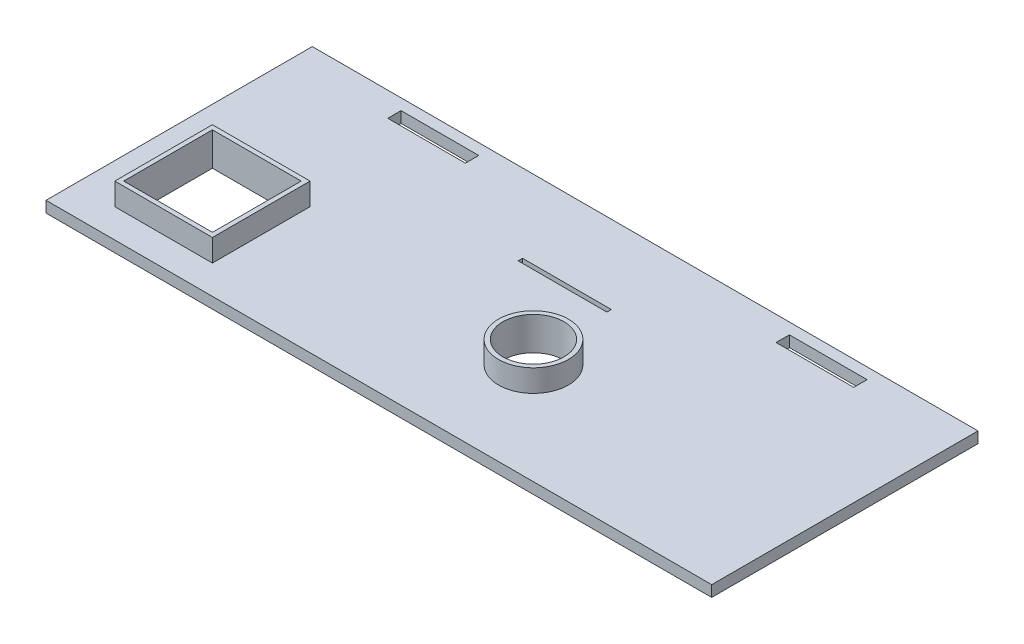
ISO-10303-21;
HEADER;
FILE_DESCRIPTION(('STEP AP214'),'2;1');
FILE_NAME('part.step','',(''),(''),'','','');
FILE_SCHEMA(('AUTOMOTIVE_DESIGN { 1 0 10303 214 1 1 1 1 }'));
ENDSEC;
DATA;
#1=APPLICATION_CONTEXT('core data for automotive mechanical design processes');
#2=APPLICATION_PROTOCOL_DEFINITION('international standard','automotive_design',2000,#1);
#3=PRODUCT_CONTEXT('',#1,'mechanical');
#4=PRODUCT('Part','Part','',(#3));
#5=PRODUCT_RELATED_PRODUCT_CATEGORY('part','',(#4));
#6=PRODUCT_DEFINITION_FORMATION('','',#4);
#7=PRODUCT_DEFINITION_CONTEXT('part definition',#1,'design');
#8=PRODUCT_DEFINITION('design','',#6,#7);
#9=PRODUCT_DEFINITION_SHAPE('','',#8);
#10=(LENGTH_UNIT() NAMED_UNIT(*) SI_UNIT(.MILLI.,.METRE.));
#11=(NAMED_UNIT(*) PLANE_ANGLE_UNIT() SI_UNIT($,.RADIAN.));
#12=(NAMED_UNIT(*) SI_UNIT($,.STERADIAN.) SOLID_ANGLE_UNIT());
#13=UNCERTAINTY_MEASURE_WITH_UNIT(LENGTH_MEASURE(1.E-05),#10,'distance_accuracy_value','');
#14=(GEOMETRIC_REPRESENTATION_CONTEXT(3) GLOBAL_UNCERTAINTY_ASSIGNED_CONTEXT((#13)) GLOBAL_UNIT_ASSIGNED_CONTEXT((#10,
#11,#12)) REPRESENTATION_CONTEXT('',''));
#15=CARTESIAN_POINT('',(0.,0.,0.));
#16=DIRECTION('',(0.,0.,1.));
#17=DIRECTION('',(1.,0.,0.));
#18=AXIS2_PLACEMENT_3D('',#15,#16,#17);
#19=CARTESIAN_POINT('',(0.,5.,0.));
#20=DIRECTION('',(0.,-1.,0.));
#21=DIRECTION('',(0.,0.,-1.));
#22=AXIS2_PLACEMENT_3D('',#19,#20,#21);
#23=PLANE('',#22);
#24=DIRECTION('',(0.,0.,-1.));
#25=VECTOR('',#24,1.);
#26=CARTESIAN_POINT('',(-88.,5.,47.));
#27=LINE('',#26,#25);
#28=CARTESIAN_POINT('',(-88.,5.,47.));
#29=VERTEX_POINT('',#28);
#30=CARTESIAN_POINT('',(-88.,5.,2.99999999999998));
#31=VERTEX_POINT('',#30);
#32=EDGE_CURVE('E254',#29,#31,#27,.T.);
#33=ORIENTED_EDGE('',*,*,#32,.F.);
#34=DIRECTION('',(1.,0.,0.));
#35=VECTOR('',#34,1.);
#36=CARTESIAN_POINT('',(-132.,5.,47.));
#37=LINE('',#36,#35);
#38=CARTESIAN_POINT('',(-132.,5.,47.));
#39=VERTEX_POINT('',#38);
#40=EDGE_CURVE('E259',#39,#29,#37,.T.);
#41=ORIENTED_EDGE('',*,*,#40,.F.);
#42=DIRECTION('',(0.,0.,1.));
#43=VECTOR('',#42,1.);
#44=CARTESIAN_POINT('',(-132.,5.,2.99999999999999));
#45=LINE('',#44,#43);
#46=CARTESIAN_POINT('',(-132.,5.,2.99999999999999));
#47=VERTEX_POINT('',#46);
#48=EDGE_CURVE('E83',#47,#39,#45,.T.);
#49=ORIENTED_EDGE('',*,*,#48,.F.);
#50=DIRECTION('',(-1.,0.,0.));
#51=VECTOR('',#50,1.);
#52=CARTESIAN_POINT('',(-88.,5.,2.99999999999998));
#53=LINE('',#52,#51);
#54=EDGE_CURVE('E78',#31,#47,#53,.T.);
#55=ORIENTED_EDGE('',*,*,#54,.F.);
#56=EDGE_LOOP('',(#33,#41,#49,#55));
#57=FACE_BOUND('',#56,.T.);
#58=DIRECTION('',(0.,0.,1.));
#59=VECTOR('',#58,1.);
#60=CARTESIAN_POINT('',(-105.,5.,-55.));
#61=LINE('',#60,#59);
#62=CARTESIAN_POINT('',(-105.,5.,-55.));
#63=VERTEX_POINT('',#62);
#64=CARTESIAN_POINT('',(-105.,5.,-49.));
#65=VERTEX_POINT('',#64);
#66=EDGE_CURVE('E360',#63,#65,#61,.T.);
#67=ORIENTED_EDGE('',*,*,#66,.F.);
#68=DIRECTION('',(-1.,0.,0.));
#69=VECTOR('',#68,1.);
#70=CARTESIAN_POINT('',(-70.,5.,-55.));
#71=LINE('',#70,#69);
#72=CARTESIAN_POINT('',(-70.,5.,-55.));
#73=VERTEX_POINT('',#72);
#74=EDGE_CURVE('E368',#73,#63,#71,.T.);
#75=ORIENTED_EDGE('',*,*,#74,.F.);
#76=DIRECTION('',(0.,0.,-1.));
#77=VECTOR('',#76,1.);
#78=CARTESIAN_POINT('',(-70.,5.,-55.));
#79=LINE('',#78,#77);
#80=CARTESIAN_POINT('',(-70.,5.,-49.));
#81=VERTEX_POINT('',#80);
#82=EDGE_CURVE('E365',#81,#73,#79,.T.);
#83=ORIENTED_EDGE('',*,*,#82,.F.);
#84=DIRECTION('',(1.,0.,0.));
#85=VECTOR('',#84,1.);
#86=CARTESIAN_POINT('',(-70.,5.,-49.));
#87=LINE('',#86,#85);
#88=EDGE_CURVE('E362',#65,#81,#87,.T.);
#89=ORIENTED_EDGE('',*,*,#88,.F.);
#90=EDGE_LOOP('',(#67,#75,#83,#89));
#91=FACE_BOUND('',#90,.T.);
#92=DIRECTION('',(0.,0.,1.));
#93=VECTOR('',#92,1.);
#94=CARTESIAN_POINT('',(-150.,5.,-60.));
#95=LINE('',#94,#93);
#96=CARTESIAN_POINT('',(-150.,5.,-60.));
#97=VERTEX_POINT('',#96);
#98=CARTESIAN_POINT('',(-150.,5.,60.));
#99=VERTEX_POINT('',#98);
#100=EDGE_CURVE('E391',#97,#99,#95,.T.);
#101=ORIENTED_EDGE('',*,*,#100,.T.);
#102=DIRECTION('',(1.,0.,0.));
#103=VECTOR('',#102,1.);
#104=CARTESIAN_POINT('',(150.,5.,60.));
#105=LINE('',#104,#103);
#106=CARTESIAN_POINT('',(150.,5.,60.));
#107=VERTEX_POINT('',#106);
#108=EDGE_CURVE('E394',#99,#107,#105,.T.);
#109=ORIENTED_EDGE('',*,*,#108,.T.);
#110=DIRECTION('',(0.,0.,-1.));
#111=VECTOR('',#110,1.);
#112=CARTESIAN_POINT('',(150.,5.,-60.));
#113=LINE('',#112,#111);
#114=CARTESIAN_POINT('',(150.,5.,-60.));
#115=VERTEX_POINT('',#114);
#116=EDGE_CURVE('E397',#107,#115,#113,.T.);
#117=ORIENTED_EDGE('',*,*,#116,.T.);
#118=DIRECTION('',(-1.,0.,0.));
#119=VECTOR('',#118,1.);
#120=CARTESIAN_POINT('',(150.,5.,-60.));
#121=LINE('',#120,#119);
#122=EDGE_CURVE('E399',#115,#97,#121,.T.);
#123=ORIENTED_EDGE('',*,*,#122,.T.);
#124=EDGE_LOOP('',(#101,#109,#117,#123));
#125=FACE_BOUND('',#124,.T.);
#126=DIRECTION('',(0.,0.,1.));
#127=VECTOR('',#126,1.);
#128=CARTESIAN_POINT('',(70.,5.,-55.));
#129=LINE('',#128,#127);
#130=CARTESIAN_POINT('',(70.,5.,-55.));
#131=VERTEX_POINT('',#130);
#132=CARTESIAN_POINT('',(70.,5.,-49.));
#133=VERTEX_POINT('',#132);
#134=EDGE_CURVE('E329',#131,#133,#129,.T.);
#135=ORIENTED_EDGE('',*,*,#134,.F.);
#136=DIRECTION('',(-1.,0.,0.));
#137=VECTOR('',#136,1.);
#138=CARTESIAN_POINT('',(105.,5.,-55.));
#139=LINE('',#138,#137);
#140=CARTESIAN_POINT('',(105.,5.,-55.));
#141=VERTEX_POINT('',#140);
#142=EDGE_CURVE('E337',#141,#131,#139,.T.);
#143=ORIENTED_EDGE('',*,*,#142,.F.);
#144=DIRECTION('',(0.,0.,-1.));
#145=VECTOR('',#144,1.);
#146=CARTESIAN_POINT('',(105.,5.,-55.));
#147=LINE('',#146,#145);
#148=CARTESIAN_POINT('',(105.,5.,-49.));
#149=VERTEX_POINT('',#148);
#150=EDGE_CURVE('E334',#149,#141,#147,.T.);
#151=ORIENTED_EDGE('',*,*,#150,.F.);
#152=DIRECTION('',(1.,0.,0.));
#153=VECTOR('',#152,1.);
#154=CARTESIAN_POINT('',(105.,5.,-49.));
#155=LINE('',#154,#153);
#156=EDGE_CURVE('E331',#133,#149,#155,.T.);
#157=ORIENTED_EDGE('',*,*,#156,.F.);
#158=EDGE_LOOP('',(#135,#143,#151,#157));
#159=FACE_BOUND('',#158,.T.);
#160=DIRECTION('',(0.,0.,1.));
#161=VECTOR('',#160,1.);
#162=CARTESIAN_POINT('',(-20.,5.,-22.7567864531014));
#163=LINE('',#162,#161);
#164=CARTESIAN_POINT('',(-20.,5.,-24.7567864531014));
#165=VERTEX_POINT('',#164);
#166=CARTESIAN_POINT('',(-20.,5.,-22.7567864531014));
#167=VERTEX_POINT('',#166);
#168=EDGE_CURVE('E286',#165,#167,#163,.T.);
#169=ORIENTED_EDGE('',*,*,#168,.F.);
#170=DIRECTION('',(-1.,0.,0.));
#171=VECTOR('',#170,1.);
#172=CARTESIAN_POINT('',(20.,5.,-24.7567864531014));
#173=LINE('',#172,#171);
#174=CARTESIAN_POINT('',(20.,5.,-24.7567864531014));
#175=VERTEX_POINT('',#174);
#176=EDGE_CURVE('E294',#175,#165,#173,.T.);
#177=ORIENTED_EDGE('',*,*,#176,.F.);
#178=DIRECTION('',(0.,0.,-1.));
#179=VECTOR('',#178,1.);
#180=CARTESIAN_POINT('',(20.,5.,-22.7567864531014));
#181=LINE('',#180,#179);
#182=CARTESIAN_POINT('',(20.,5.,-22.7567864531014));
#183=VERTEX_POINT('',#182);
#184=EDGE_CURVE('E291',#183,#175,#181,.T.);
#185=ORIENTED_EDGE('',*,*,#184,.F.);
#186=DIRECTION('',(1.,0.,0.));
#187=VECTOR('',#186,1.);
#188=CARTESIAN_POINT('',(20.,5.,-22.7567864531014));
#189=LINE('',#188,#187);
#190=EDGE_CURVE('E288',#167,#183,#189,.T.);
#191=ORIENTED_EDGE('',*,*,#190,.F.);
#192=EDGE_LOOP('',(#169,#177,#185,#191));
#193=FACE_BOUND('',#192,.T.);
#194=CARTESIAN_POINT('',(24.0743870529523,5.,14.4073090658306));
#195=DIRECTION('',(0.,-1.,0.));
#196=DIRECTION('',(0.,0.,-1.));
#197=AXIS2_PLACEMENT_3D('',#194,#195,#196);
#198=CIRCLE('',#197,15.75);
#199=CARTESIAN_POINT('',(24.0743870529523,5.,-1.3426909341694));
#200=VERTEX_POINT('',#199);
#201=EDGE_CURVE('E12',#200,#200,#198,.F.);
#202=ORIENTED_EDGE('',*,*,#201,.F.);
#203=EDGE_LOOP('',(#202));
#204=FACE_BOUND('',#203,.T.);
#205=ADVANCED_FACE('F63',(#57,#91,#125,#159,#193,#204),#23,.F.);
#206=CARTESIAN_POINT('',(0.,0.,0.));
#207=DIRECTION('',(0.,-1.,0.));
#208=DIRECTION('',(0.,0.,-1.));
#209=AXIS2_PLACEMENT_3D('',#206,#207,#208);
#210=PLANE('',#209);
#211=DIRECTION('',(-1.,0.,0.));
#212=VECTOR('',#211,1.);
#213=CARTESIAN_POINT('',(20.,0.,-24.7567864531014));
#214=LINE('',#213,#212);
#215=CARTESIAN_POINT('',(20.,0.,-24.7567864531014));
#216=VERTEX_POINT('',#215);
#217=CARTESIAN_POINT('',(-20.,0.,-24.7567864531014));
#218=VERTEX_POINT('',#217);
#219=EDGE_CURVE('E289',#216,#218,#214,.T.);
#220=ORIENTED_EDGE('',*,*,#219,.T.);
#221=DIRECTION('',(0.,0.,1.));
#222=VECTOR('',#221,1.);
#223=CARTESIAN_POINT('',(-20.,0.,-22.7567864531014));
#224=LINE('',#223,#222);
#225=CARTESIAN_POINT('',(-20.,0.,-22.7567864531014));
#226=VERTEX_POINT('',#225);
#227=EDGE_CURVE('E285',#218,#226,#224,.T.);
#228=ORIENTED_EDGE('',*,*,#227,.T.);
#229=DIRECTION('',(1.,0.,0.));
#230=VECTOR('',#229,1.);
#231=CARTESIAN_POINT('',(20.,0.,-22.7567864531014));
#232=LINE('',#231,#230);
#233=CARTESIAN_POINT('',(20.,0.,-22.7567864531014));
#234=VERTEX_POINT('',#233);
#235=EDGE_CURVE('E299',#226,#234,#232,.T.);
#236=ORIENTED_EDGE('',*,*,#235,.T.);
#237=DIRECTION('',(0.,0.,-1.));
#238=VECTOR('',#237,1.);
#239=CARTESIAN_POINT('',(20.,0.,-22.7567864531014));
#240=LINE('',#239,#238);
#241=EDGE_CURVE('E302',#234,#216,#240,.T.);
#242=ORIENTED_EDGE('',*,*,#241,.T.);
#243=EDGE_LOOP('',(#220,#228,#236,#242));
#244=FACE_BOUND('',#243,.T.);
#245=DIRECTION('',(-1.,0.,0.));
#246=VECTOR('',#245,1.);
#247=CARTESIAN_POINT('',(-90.,0.,4.99999999999998));
#248=LINE('',#247,#246);
#249=CARTESIAN_POINT('',(-90.,0.,4.99999999999998));
#250=VERTEX_POINT('',#249);
#251=CARTESIAN_POINT('',(-130.,0.,4.99999999999999));
#252=VERTEX_POINT('',#251);
#253=EDGE_CURVE('E322',#250,#252,#248,.T.);
#254=ORIENTED_EDGE('',*,*,#253,.T.);
#255=DIRECTION('',(0.,0.,1.));
#256=VECTOR('',#255,1.);
#257=CARTESIAN_POINT('',(-130.,0.,4.99999999999999));
#258=LINE('',#257,#256);
#259=CARTESIAN_POINT('',(-130.,0.,45.));
#260=VERTEX_POINT('',#259);
#261=EDGE_CURVE('E316',#252,#260,#258,.T.);
#262=ORIENTED_EDGE('',*,*,#261,.T.);
#263=DIRECTION('',(1.,0.,0.));
#264=VECTOR('',#263,1.);
#265=CARTESIAN_POINT('',(-90.,0.,45.));
#266=LINE('',#265,#264);
#267=CARTESIAN_POINT('',(-90.,0.,45.));
#268=VERTEX_POINT('',#267);
#269=EDGE_CURVE('E229',#260,#268,#266,.T.);
#270=ORIENTED_EDGE('',*,*,#269,.T.);
#271=DIRECTION('',(0.,0.,-1.));
#272=VECTOR('',#271,1.);
#273=CARTESIAN_POINT('',(-90.,0.,4.99999999999998));
#274=LINE('',#273,#272);
#275=EDGE_CURVE('E319',#268,#250,#274,.T.);
#276=ORIENTED_EDGE('',*,*,#275,.T.);
#277=EDGE_LOOP('',(#254,#262,#270,#276));
#278=FACE_BOUND('',#277,.T.);
#279=DIRECTION('',(-1.,0.,0.));
#280=VECTOR('',#279,1.);
#281=CARTESIAN_POINT('',(105.,0.,-55.));
#282=LINE('',#281,#280);
#283=CARTESIAN_POINT('',(105.,0.,-55.));
#284=VERTEX_POINT('',#283);
#285=CARTESIAN_POINT('',(70.,0.,-55.));
#286=VERTEX_POINT('',#285);
#287=EDGE_CURVE('E332',#284,#286,#282,.T.);
#288=ORIENTED_EDGE('',*,*,#287,.T.);
#289=DIRECTION('',(0.,0.,1.));
#290=VECTOR('',#289,1.);
#291=CARTESIAN_POINT('',(70.,0.,-55.));
#292=LINE('',#291,#290);
#293=CARTESIAN_POINT('',(70.,0.,-49.));
#294=VERTEX_POINT('',#293);
#295=EDGE_CURVE('E232',#286,#294,#292,.T.);
#296=ORIENTED_EDGE('',*,*,#295,.T.);
#297=DIRECTION('',(1.,0.,0.));
#298=VECTOR('',#297,1.);
#299=CARTESIAN_POINT('',(105.,0.,-49.));
#300=LINE('',#299,#298);
#301=CARTESIAN_POINT('',(105.,0.,-49.));
#302=VERTEX_POINT('',#301);
#303=EDGE_CURVE('E342',#294,#302,#300,.T.);
#304=ORIENTED_EDGE('',*,*,#303,.T.);
#305=DIRECTION('',(0.,0.,-1.));
#306=VECTOR('',#305,1.);
#307=CARTESIAN_POINT('',(105.,0.,-55.));
#308=LINE('',#307,#306);
#309=EDGE_CURVE('E345',#302,#284,#308,.T.);
#310=ORIENTED_EDGE('',*,*,#309,.T.);
#311=EDGE_LOOP('',(#288,#296,#304,#310));
#312=FACE_BOUND('',#311,.T.);
#313=DIRECTION('',(-1.,0.,0.));
#314=VECTOR('',#313,1.);
#315=CARTESIAN_POINT('',(-70.,0.,-55.));
#316=LINE('',#315,#314);
#317=CARTESIAN_POINT('',(-70.,0.,-55.));
#318=VERTEX_POINT('',#317);
#319=CARTESIAN_POINT('',(-105.,0.,-55.));
#320=VERTEX_POINT('',#319);
#321=EDGE_CURVE('E363',#318,#320,#316,.T.);
#322=ORIENTED_EDGE('',*,*,#321,.T.);
#323=DIRECTION('',(0.,0.,1.));
#324=VECTOR('',#323,1.);
#325=CARTESIAN_POINT('',(-105.,0.,-55.));
#326=LINE('',#325,#324);
#327=CARTESIAN_POINT('',(-105.,0.,-49.));
#328=VERTEX_POINT('',#327);
#329=EDGE_CURVE('E359',#320,#328,#326,.T.);
#330=ORIENTED_EDGE('',*,*,#329,.T.);
#331=DIRECTION('',(1.,0.,0.));
#332=VECTOR('',#331,1.);
#333=CARTESIAN_POINT('',(-70.,0.,-49.));
#334=LINE('',#333,#332);
#335=CARTESIAN_POINT('',(-70.,0.,-49.));
#336=VERTEX_POINT('',#335);
#337=EDGE_CURVE('E373',#328,#336,#334,.T.);
#338=ORIENTED_EDGE('',*,*,#337,.T.);
#339=DIRECTION('',(0.,0.,-1.));
#340=VECTOR('',#339,1.);
#341=CARTESIAN_POINT('',(-70.,0.,-55.));
#342=LINE('',#341,#340);
#343=EDGE_CURVE('E376',#336,#318,#342,.T.);
#344=ORIENTED_EDGE('',*,*,#343,.T.);
#345=EDGE_LOOP('',(#322,#330,#338,#344));
#346=FACE_BOUND('',#345,.T.);
#347=DIRECTION('',(0.,0.,1.));
#348=VECTOR('',#347,1.);
#349=CARTESIAN_POINT('',(-150.,0.,-60.));
#350=LINE('',#349,#348);
#351=CARTESIAN_POINT('',(-150.,0.,-60.));
#352=VERTEX_POINT('',#351);
#353=CARTESIAN_POINT('',(-150.,0.,60.));
#354=VERTEX_POINT('',#353);
#355=EDGE_CURVE('E390',#352,#354,#350,.T.);
#356=ORIENTED_EDGE('',*,*,#355,.F.);
#357=DIRECTION('',(-1.,0.,0.));
#358=VECTOR('',#357,1.);
#359=CARTESIAN_POINT('',(150.,0.,-60.));
#360=LINE('',#359,#358);
#361=CARTESIAN_POINT('',(150.,0.,-60.));
#362=VERTEX_POINT('',#361);
#363=EDGE_CURVE('E395',#362,#352,#360,.T.);
#364=ORIENTED_EDGE('',*,*,#363,.F.);
#365=DIRECTION('',(0.,0.,-1.));
#366=VECTOR('',#365,1.);
#367=CARTESIAN_POINT('',(150.,0.,-60.));
#368=LINE('',#367,#366);
#369=CARTESIAN_POINT('',(150.,0.,60.));
#370=VERTEX_POINT('',#369);
#371=EDGE_CURVE('E406',#370,#362,#368,.T.);
#372=ORIENTED_EDGE('',*,*,#371,.F.);
#373=DIRECTION('',(1.,0.,0.));
#374=VECTOR('',#373,1.);
#375=CARTESIAN_POINT('',(150.,0.,60.));
#376=LINE('',#375,#374);
#377=EDGE_CURVE('E404',#354,#370,#376,.T.);
#378=ORIENTED_EDGE('',*,*,#377,.F.);
#379=EDGE_LOOP('',(#356,#364,#372,#378));
#380=FACE_BOUND('',#379,.T.);
#381=CARTESIAN_POINT('',(24.0743870529523,0.,14.4073090658306));
#382=DIRECTION('',(0.,1.,0.));
#383=DIRECTION('',(0.,0.,1.));
#384=AXIS2_PLACEMENT_3D('',#381,#382,#383);
#385=CIRCLE('',#384,13.75);
#386=CARTESIAN_POINT('',(24.0743870529523,0.,28.1573090658306));
#387=VERTEX_POINT('',#386);
#388=EDGE_CURVE('E282',#387,#387,#385,.T.);
#389=ORIENTED_EDGE('',*,*,#388,.T.);
#390=EDGE_LOOP('',(#389));
#391=FACE_BOUND('',#390,.T.);
#392=ADVANCED_FACE('F427',(#244,#278,#312,#346,#380,#391),#210,.T.);
#393=CARTESIAN_POINT('',(-150.,5.,-60.));
#394=DIRECTION('',(1.,0.,0.));
#395=DIRECTION('',(0.,0.,-1.));
#396=AXIS2_PLACEMENT_3D('',#393,#394,#395);
#397=PLANE('',#396);
#398=ORIENTED_EDGE('',*,*,#355,.T.);
#399=DIRECTION('',(0.,-1.,0.));
#400=VECTOR('',#399,1.);
#401=CARTESIAN_POINT('',(-150.,5.,60.));
#402=LINE('',#401,#400);
#403=EDGE_CURVE('E71',#99,#354,#402,.T.);
#404=ORIENTED_EDGE('',*,*,#403,.F.);
#405=ORIENTED_EDGE('',*,*,#100,.F.);
#406=DIRECTION('',(0.,-1.,0.));
#407=VECTOR('',#406,1.);
#408=CARTESIAN_POINT('',(-150.,5.,-60.));
#409=LINE('',#408,#407);
#410=EDGE_CURVE('E401',#97,#352,#409,.T.);
#411=ORIENTED_EDGE('',*,*,#410,.T.);
#412=EDGE_LOOP('',(#398,#404,#405,#411));
#413=FACE_BOUND('',#412,.T.);
#414=ADVANCED_FACE('F65',(#413),#397,.F.);
#415=CARTESIAN_POINT('',(150.,5.,60.));
#416=DIRECTION('',(0.,0.,-1.));
#417=DIRECTION('',(-1.,0.,0.));
#418=AXIS2_PLACEMENT_3D('',#415,#416,#417);
#419=PLANE('',#418);
#420=ORIENTED_EDGE('',*,*,#377,.T.);
#421=DIRECTION('',(0.,-1.,0.));
#422=VECTOR('',#421,1.);
#423=CARTESIAN_POINT('',(150.,5.,60.));
#424=LINE('',#423,#422);
#425=EDGE_CURVE('E414',#107,#370,#424,.T.);
#426=ORIENTED_EDGE('',*,*,#425,.F.);
#427=ORIENTED_EDGE('',*,*,#108,.F.);
#428=ORIENTED_EDGE('',*,*,#403,.T.);
#429=EDGE_LOOP('',(#420,#426,#427,#428));
#430=FACE_BOUND('',#429,.T.);
#431=ADVANCED_FACE('F419',(#430),#419,.F.);
#432=CARTESIAN_POINT('',(150.,5.,-60.));
#433=DIRECTION('',(-1.,0.,0.));
#434=DIRECTION('',(0.,0.,1.));
#435=AXIS2_PLACEMENT_3D('',#432,#433,#434);
#436=PLANE('',#435);
#437=ORIENTED_EDGE('',*,*,#371,.T.);
#438=DIRECTION('',(0.,-1.,0.));
#439=VECTOR('',#438,1.);
#440=CARTESIAN_POINT('',(150.,5.,-60.));
#441=LINE('',#440,#439);
#442=EDGE_CURVE('E411',#115,#362,#441,.T.);
#443=ORIENTED_EDGE('',*,*,#442,.F.);
#444=ORIENTED_EDGE('',*,*,#116,.F.);
#445=ORIENTED_EDGE('',*,*,#425,.T.);
#446=EDGE_LOOP('',(#437,#443,#444,#445));
#447=FACE_BOUND('',#446,.T.);
#448=ADVANCED_FACE('F432',(#447),#436,.F.);
#449=CARTESIAN_POINT('',(150.,5.,-60.));
#450=DIRECTION('',(0.,0.,1.));
#451=DIRECTION('',(1.,0.,0.));
#452=AXIS2_PLACEMENT_3D('',#449,#450,#451);
#453=PLANE('',#452);
#454=ORIENTED_EDGE('',*,*,#363,.T.);
#455=ORIENTED_EDGE('',*,*,#410,.F.);
#456=ORIENTED_EDGE('',*,*,#122,.F.);
#457=ORIENTED_EDGE('',*,*,#442,.T.);
#458=EDGE_LOOP('',(#454,#455,#456,#457));
#459=FACE_BOUND('',#458,.T.);
#460=ADVANCED_FACE('F436',(#459),#453,.F.);
#461=CARTESIAN_POINT('',(-105.,5.,-55.));
#462=DIRECTION('',(1.,0.,0.));
#463=DIRECTION('',(0.,0.,-1.));
#464=AXIS2_PLACEMENT_3D('',#461,#462,#463);
#465=PLANE('',#464);
#466=ORIENTED_EDGE('',*,*,#329,.F.);
#467=DIRECTION('',(0.,-1.,0.));
#468=VECTOR('',#467,1.);
#469=CARTESIAN_POINT('',(-105.,5.,-55.));
#470=LINE('',#469,#468);
#471=EDGE_CURVE('E370',#63,#320,#470,.T.);
#472=ORIENTED_EDGE('',*,*,#471,.F.);
#473=ORIENTED_EDGE('',*,*,#66,.T.);
#474=DIRECTION('',(0.,-1.,0.));
#475=VECTOR('',#474,1.);
#476=CARTESIAN_POINT('',(-105.,5.,-49.));
#477=LINE('',#476,#475);
#478=EDGE_CURVE('E387',#65,#328,#477,.T.);
#479=ORIENTED_EDGE('',*,*,#478,.T.);
#480=EDGE_LOOP('',(#466,#472,#473,#479));
#481=FACE_BOUND('',#480,.T.);
#482=ADVANCED_FACE('F541',(#481),#465,.T.);
#483=CARTESIAN_POINT('',(-70.,5.,-49.));
#484=DIRECTION('',(0.,0.,-1.));
#485=DIRECTION('',(-1.,0.,0.));
#486=AXIS2_PLACEMENT_3D('',#483,#484,#485);
#487=PLANE('',#486);
#488=ORIENTED_EDGE('',*,*,#337,.F.);
#489=ORIENTED_EDGE('',*,*,#478,.F.);
#490=ORIENTED_EDGE('',*,*,#88,.T.);
#491=DIRECTION('',(0.,-1.,0.));
#492=VECTOR('',#491,1.);
#493=CARTESIAN_POINT('',(-70.,5.,-49.));
#494=LINE('',#493,#492);
#495=EDGE_CURVE('E385',#81,#336,#494,.T.);
#496=ORIENTED_EDGE('',*,*,#495,.T.);
#497=EDGE_LOOP('',(#488,#489,#490,#496));
#498=FACE_BOUND('',#497,.T.);
#499=ADVANCED_FACE('F537',(#498),#487,.T.);
#500=CARTESIAN_POINT('',(-70.,5.,-55.));
#501=DIRECTION('',(-1.,0.,0.));
#502=DIRECTION('',(0.,0.,1.));
#503=AXIS2_PLACEMENT_3D('',#500,#501,#502);
#504=PLANE('',#503);
#505=ORIENTED_EDGE('',*,*,#343,.F.);
#506=ORIENTED_EDGE('',*,*,#495,.F.);
#507=ORIENTED_EDGE('',*,*,#82,.T.);
#508=DIRECTION('',(0.,-1.,0.));
#509=VECTOR('',#508,1.);
#510=CARTESIAN_POINT('',(-70.,5.,-55.));
#511=LINE('',#510,#509);
#512=EDGE_CURVE('E383',#73,#318,#511,.T.);
#513=ORIENTED_EDGE('',*,*,#512,.T.);
#514=EDGE_LOOP('',(#505,#506,#507,#513));
#515=FACE_BOUND('',#514,.T.);
#516=ADVANCED_FACE('F533',(#515),#504,.T.);
#517=CARTESIAN_POINT('',(-70.,5.,-55.));
#518=DIRECTION('',(0.,0.,1.));
#519=DIRECTION('',(1.,0.,0.));
#520=AXIS2_PLACEMENT_3D('',#517,#518,#519);
#521=PLANE('',#520);
#522=ORIENTED_EDGE('',*,*,#321,.F.);
#523=ORIENTED_EDGE('',*,*,#512,.F.);
#524=ORIENTED_EDGE('',*,*,#74,.T.);
#525=ORIENTED_EDGE('',*,*,#471,.T.);
#526=EDGE_LOOP('',(#522,#523,#524,#525));
#527=FACE_BOUND('',#526,.T.);
#528=ADVANCED_FACE('F529',(#527),#521,.T.);
#529=CARTESIAN_POINT('',(70.,5.,-55.));
#530=DIRECTION('',(1.,0.,0.));
#531=DIRECTION('',(0.,0.,-1.));
#532=AXIS2_PLACEMENT_3D('',#529,#530,#531);
#533=PLANE('',#532);
#534=ORIENTED_EDGE('',*,*,#295,.F.);
#535=DIRECTION('',(0.,-1.,0.));
#536=VECTOR('',#535,1.);
#537=CARTESIAN_POINT('',(70.,5.,-55.));
#538=LINE('',#537,#536);
#539=EDGE_CURVE('E339',#131,#286,#538,.T.);
#540=ORIENTED_EDGE('',*,*,#539,.F.);
#541=ORIENTED_EDGE('',*,*,#134,.T.);
#542=DIRECTION('',(0.,-1.,0.));
#543=VECTOR('',#542,1.);
#544=CARTESIAN_POINT('',(70.,5.,-49.));
#545=LINE('',#544,#543);
#546=EDGE_CURVE('E356',#133,#294,#545,.T.);
#547=ORIENTED_EDGE('',*,*,#546,.T.);
#548=EDGE_LOOP('',(#534,#540,#541,#547));
#549=FACE_BOUND('',#548,.T.);
#550=ADVANCED_FACE('F525',(#549),#533,.T.);
#551=CARTESIAN_POINT('',(105.,5.,-49.));
#552=DIRECTION('',(0.,0.,-1.));
#553=DIRECTION('',(-1.,0.,0.));
#554=AXIS2_PLACEMENT_3D('',#551,#552,#553);
#555=PLANE('',#554);
#556=ORIENTED_EDGE('',*,*,#303,.F.);
#557=ORIENTED_EDGE('',*,*,#546,.F.);
#558=ORIENTED_EDGE('',*,*,#156,.T.);
#559=DIRECTION('',(0.,-1.,0.));
#560=VECTOR('',#559,1.);
#561=CARTESIAN_POINT('',(105.,5.,-49.));
#562=LINE('',#561,#560);
#563=EDGE_CURVE('E354',#149,#302,#562,.T.);
#564=ORIENTED_EDGE('',*,*,#563,.T.);
#565=EDGE_LOOP('',(#556,#557,#558,#564));
#566=FACE_BOUND('',#565,.T.);
#567=ADVANCED_FACE('F521',(#566),#555,.T.);
#568=CARTESIAN_POINT('',(105.,5.,-55.));
#569=DIRECTION('',(-1.,0.,0.));
#570=DIRECTION('',(0.,0.,1.));
#571=AXIS2_PLACEMENT_3D('',#568,#569,#570);
#572=PLANE('',#571);
#573=ORIENTED_EDGE('',*,*,#309,.F.);
#574=ORIENTED_EDGE('',*,*,#563,.F.);
#575=ORIENTED_EDGE('',*,*,#150,.T.);
#576=DIRECTION('',(0.,-1.,0.));
#577=VECTOR('',#576,1.);
#578=CARTESIAN_POINT('',(105.,5.,-55.));
#579=LINE('',#578,#577);
#580=EDGE_CURVE('E352',#141,#284,#579,.T.);
#581=ORIENTED_EDGE('',*,*,#580,.T.);
#582=EDGE_LOOP('',(#573,#574,#575,#581));
#583=FACE_BOUND('',#582,.T.);
#584=ADVANCED_FACE('F517',(#583),#572,.T.);
#585=CARTESIAN_POINT('',(105.,5.,-55.));
#586=DIRECTION('',(0.,0.,1.));
#587=DIRECTION('',(1.,0.,0.));
#588=AXIS2_PLACEMENT_3D('',#585,#586,#587);
#589=PLANE('',#588);
#590=ORIENTED_EDGE('',*,*,#287,.F.);
#591=ORIENTED_EDGE('',*,*,#580,.F.);
#592=ORIENTED_EDGE('',*,*,#142,.T.);
#593=ORIENTED_EDGE('',*,*,#539,.T.);
#594=EDGE_LOOP('',(#590,#591,#592,#593));
#595=FACE_BOUND('',#594,.T.);
#596=ADVANCED_FACE('F514',(#595),#589,.T.);
#597=CARTESIAN_POINT('',(-130.,5.,4.99999999999999));
#598=DIRECTION('',(1.,0.,0.));
#599=DIRECTION('',(0.,0.,-1.));
#600=AXIS2_PLACEMENT_3D('',#597,#598,#599);
#601=PLANE('',#600);
#602=ORIENTED_EDGE('',*,*,#261,.F.);
#603=DIRECTION('',(0.,-1.,0.));
#604=VECTOR('',#603,1.);
#605=CARTESIAN_POINT('',(-130.,5.,4.99999999999999));
#606=LINE('',#605,#604);
#607=CARTESIAN_POINT('',(-130.,15.,4.99999999999999));
#608=VERTEX_POINT('',#607);
#609=EDGE_CURVE('E239',#608,#252,#606,.T.);
#610=ORIENTED_EDGE('',*,*,#609,.F.);
#611=DIRECTION('',(0.,0.,1.));
#612=VECTOR('',#611,1.);
#613=CARTESIAN_POINT('',(-130.,15.,4.99999999999999));
#614=LINE('',#613,#612);
#615=CARTESIAN_POINT('',(-130.,15.,45.));
#616=VERTEX_POINT('',#615);
#617=EDGE_CURVE('E236',#608,#616,#614,.T.);
#618=ORIENTED_EDGE('',*,*,#617,.T.);
#619=DIRECTION('',(0.,-1.,0.));
#620=VECTOR('',#619,1.);
#621=CARTESIAN_POINT('',(-130.,5.,45.));
#622=LINE('',#621,#620);
#623=EDGE_CURVE('E222',#616,#260,#622,.T.);
#624=ORIENTED_EDGE('',*,*,#623,.T.);
#625=EDGE_LOOP('',(#602,#610,#618,#624));
#626=FACE_BOUND('',#625,.T.);
#627=ADVANCED_FACE('F237',(#626),#601,.T.);
#628=CARTESIAN_POINT('',(-90.,5.,45.));
#629=DIRECTION('',(0.,0.,-1.));
#630=DIRECTION('',(-1.,0.,0.));
#631=AXIS2_PLACEMENT_3D('',#628,#629,#630);
#632=PLANE('',#631);
#633=ORIENTED_EDGE('',*,*,#269,.F.);
#634=ORIENTED_EDGE('',*,*,#623,.F.);
#635=DIRECTION('',(1.,0.,0.));
#636=VECTOR('',#635,1.);
#637=CARTESIAN_POINT('',(-130.,15.,45.));
#638=LINE('',#637,#636);
#639=CARTESIAN_POINT('',(-90.,15.,45.));
#640=VERTEX_POINT('',#639);
#641=EDGE_CURVE('E226',#616,#640,#638,.T.);
#642=ORIENTED_EDGE('',*,*,#641,.T.);
#643=DIRECTION('',(0.,-1.,0.));
#644=VECTOR('',#643,1.);
#645=CARTESIAN_POINT('',(-90.,5.,45.));
#646=LINE('',#645,#644);
#647=EDGE_CURVE('E233',#640,#268,#646,.T.);
#648=ORIENTED_EDGE('',*,*,#647,.T.);
#649=EDGE_LOOP('',(#633,#634,#642,#648));
#650=FACE_BOUND('',#649,.T.);
#651=ADVANCED_FACE('F224',(#650),#632,.T.);
#652=CARTESIAN_POINT('',(-90.,5.,4.99999999999998));
#653=DIRECTION('',(-1.,0.,0.));
#654=DIRECTION('',(0.,0.,1.));
#655=AXIS2_PLACEMENT_3D('',#652,#653,#654);
#656=PLANE('',#655);
#657=ORIENTED_EDGE('',*,*,#275,.F.);
#658=ORIENTED_EDGE('',*,*,#647,.F.);
#659=DIRECTION('',(0.,0.,-1.));
#660=VECTOR('',#659,1.);
#661=CARTESIAN_POINT('',(-90.,15.,45.));
#662=LINE('',#661,#660);
#663=CARTESIAN_POINT('',(-90.,15.,4.99999999999998));
#664=VERTEX_POINT('',#663);
#665=EDGE_CURVE('E247',#640,#664,#662,.T.);
#666=ORIENTED_EDGE('',*,*,#665,.T.);
#667=DIRECTION('',(0.,-1.,0.));
#668=VECTOR('',#667,1.);
#669=CARTESIAN_POINT('',(-90.,5.,4.99999999999998));
#670=LINE('',#669,#668);
#671=EDGE_CURVE('E326',#664,#250,#670,.T.);
#672=ORIENTED_EDGE('',*,*,#671,.T.);
#673=EDGE_LOOP('',(#657,#658,#666,#672));
#674=FACE_BOUND('',#673,.T.);
#675=ADVANCED_FACE('F505',(#674),#656,.T.);
#676=CARTESIAN_POINT('',(-90.,5.,4.99999999999998));
#677=DIRECTION('',(0.,0.,1.));
#678=DIRECTION('',(1.,0.,0.));
#679=AXIS2_PLACEMENT_3D('',#676,#677,#678);
#680=PLANE('',#679);
#681=ORIENTED_EDGE('',*,*,#253,.F.);
#682=ORIENTED_EDGE('',*,*,#671,.F.);
#683=DIRECTION('',(-1.,0.,0.));
#684=VECTOR('',#683,1.);
#685=CARTESIAN_POINT('',(-90.,15.,4.99999999999998));
#686=LINE('',#685,#684);
#687=EDGE_CURVE('E249',#664,#608,#686,.T.);
#688=ORIENTED_EDGE('',*,*,#687,.T.);
#689=ORIENTED_EDGE('',*,*,#609,.T.);
#690=EDGE_LOOP('',(#681,#682,#688,#689));
#691=FACE_BOUND('',#690,.T.);
#692=ADVANCED_FACE('F501',(#691),#680,.T.);
#693=CARTESIAN_POINT('',(-20.,5.,-22.7567864531014));
#694=DIRECTION('',(1.,0.,0.));
#695=DIRECTION('',(0.,0.,-1.));
#696=AXIS2_PLACEMENT_3D('',#693,#694,#695);
#697=PLANE('',#696);
#698=ORIENTED_EDGE('',*,*,#227,.F.);
#699=DIRECTION('',(0.,-1.,0.));
#700=VECTOR('',#699,1.);
#701=CARTESIAN_POINT('',(-20.,5.,-24.7567864531014));
#702=LINE('',#701,#700);
#703=EDGE_CURVE('E296',#165,#218,#702,.T.);
#704=ORIENTED_EDGE('',*,*,#703,.F.);
#705=ORIENTED_EDGE('',*,*,#168,.T.);
#706=DIRECTION('',(0.,-1.,0.));
#707=VECTOR('',#706,1.);
#708=CARTESIAN_POINT('',(-20.,5.,-22.7567864531014));
#709=LINE('',#708,#707);
#710=EDGE_CURVE('E313',#167,#226,#709,.T.);
#711=ORIENTED_EDGE('',*,*,#710,.T.);
#712=EDGE_LOOP('',(#698,#704,#705,#711));
#713=FACE_BOUND('',#712,.T.);
#714=ADVANCED_FACE('F497',(#713),#697,.T.);
#715=CARTESIAN_POINT('',(20.,5.,-22.7567864531014));
#716=DIRECTION('',(0.,0.,-1.));
#717=DIRECTION('',(-1.,0.,0.));
#718=AXIS2_PLACEMENT_3D('',#715,#716,#717);
#719=PLANE('',#718);
#720=ORIENTED_EDGE('',*,*,#235,.F.);
#721=ORIENTED_EDGE('',*,*,#710,.F.);
#722=ORIENTED_EDGE('',*,*,#190,.T.);
#723=DIRECTION('',(0.,-1.,0.));
#724=VECTOR('',#723,1.);
#725=CARTESIAN_POINT('',(20.,5.,-22.7567864531014));
#726=LINE('',#725,#724);
#727=EDGE_CURVE('E311',#183,#234,#726,.T.);
#728=ORIENTED_EDGE('',*,*,#727,.T.);
#729=EDGE_LOOP('',(#720,#721,#722,#728));
#730=FACE_BOUND('',#729,.T.);
#731=ADVANCED_FACE('F493',(#730),#719,.T.);
#732=CARTESIAN_POINT('',(20.,5.,-22.7567864531014));
#733=DIRECTION('',(-1.,0.,0.));
#734=DIRECTION('',(0.,0.,1.));
#735=AXIS2_PLACEMENT_3D('',#732,#733,#734);
#736=PLANE('',#735);
#737=ORIENTED_EDGE('',*,*,#241,.F.);
#738=ORIENTED_EDGE('',*,*,#727,.F.);
#739=ORIENTED_EDGE('',*,*,#184,.T.);
#740=DIRECTION('',(0.,-1.,0.));
#741=VECTOR('',#740,1.);
#742=CARTESIAN_POINT('',(20.,5.,-24.7567864531014));
#743=LINE('',#742,#741);
#744=EDGE_CURVE('E309',#175,#216,#743,.T.);
#745=ORIENTED_EDGE('',*,*,#744,.T.);
#746=EDGE_LOOP('',(#737,#738,#739,#745));
#747=FACE_BOUND('',#746,.T.);
#748=ADVANCED_FACE('F489',(#747),#736,.T.);
#749=CARTESIAN_POINT('',(20.,5.,-24.7567864531014));
#750=DIRECTION('',(0.,0.,1.));
#751=DIRECTION('',(1.,0.,0.));
#752=AXIS2_PLACEMENT_3D('',#749,#750,#751);
#753=PLANE('',#752);
#754=ORIENTED_EDGE('',*,*,#219,.F.);
#755=ORIENTED_EDGE('',*,*,#744,.F.);
#756=ORIENTED_EDGE('',*,*,#176,.T.);
#757=ORIENTED_EDGE('',*,*,#703,.T.);
#758=EDGE_LOOP('',(#754,#755,#756,#757));
#759=FACE_BOUND('',#758,.T.);
#760=ADVANCED_FACE('F485',(#759),#753,.T.);
#761=CARTESIAN_POINT('',(24.0743870529523,5.,14.4073090658306));
#762=DIRECTION('',(0.,-1.,0.));
#763=DIRECTION('',(0.,0.,-1.));
#764=AXIS2_PLACEMENT_3D('',#761,#762,#763);
#765=CYLINDRICAL_SURFACE('',#764,13.75);
#766=ORIENTED_EDGE('',*,*,#388,.F.);
#767=EDGE_LOOP('',(#766));
#768=FACE_BOUND('',#767,.T.);
#769=CARTESIAN_POINT('',(24.0743870529523,15.,14.4073090658306));
#770=DIRECTION('',(0.,1.,0.));
#771=DIRECTION('',(0.,0.,1.));
#772=AXIS2_PLACEMENT_3D('',#769,#770,#771);
#773=CIRCLE('',#772,13.75);
#774=CARTESIAN_POINT('',(24.0743870529523,15.,28.1573090658306));
#775=VERTEX_POINT('',#774);
#776=EDGE_CURVE('E243',#775,#775,#773,.T.);
#777=ORIENTED_EDGE('',*,*,#776,.T.);
#778=EDGE_LOOP('',(#777));
#779=FACE_BOUND('',#778,.T.);
#780=ADVANCED_FACE('F467',(#768,#779),#765,.F.);
#781=CARTESIAN_POINT('',(0.,15.,0.));
#782=DIRECTION('',(0.,1.,0.));
#783=DIRECTION('',(0.,0.,1.));
#784=AXIS2_PLACEMENT_3D('',#781,#782,#783);
#785=PLANE('',#784);
#786=DIRECTION('',(0.,0.,-1.));
#787=VECTOR('',#786,1.);
#788=CARTESIAN_POINT('',(-88.,15.,47.));
#789=LINE('',#788,#787);
#790=CARTESIAN_POINT('',(-88.,15.,47.));
#791=VERTEX_POINT('',#790);
#792=CARTESIAN_POINT('',(-88.,15.,2.99999999999998));
#793=VERTEX_POINT('',#792);
#794=EDGE_CURVE('E255',#791,#793,#789,.T.);
#795=ORIENTED_EDGE('',*,*,#794,.T.);
#796=DIRECTION('',(-1.,0.,0.));
#797=VECTOR('',#796,1.);
#798=CARTESIAN_POINT('',(-88.,15.,2.99999999999998));
#799=LINE('',#798,#797);
#800=CARTESIAN_POINT('',(-132.,15.,2.99999999999999));
#801=VERTEX_POINT('',#800);
#802=EDGE_CURVE('E258',#793,#801,#799,.T.);
#803=ORIENTED_EDGE('',*,*,#802,.T.);
#804=DIRECTION('',(0.,0.,1.));
#805=VECTOR('',#804,1.);
#806=CARTESIAN_POINT('',(-132.,15.,2.99999999999999));
#807=LINE('',#806,#805);
#808=CARTESIAN_POINT('',(-132.,15.,47.));
#809=VERTEX_POINT('',#808);
#810=EDGE_CURVE('E261',#801,#809,#807,.T.);
#811=ORIENTED_EDGE('',*,*,#810,.T.);
#812=DIRECTION('',(1.,0.,0.));
#813=VECTOR('',#812,1.);
#814=CARTESIAN_POINT('',(-132.,15.,47.));
#815=LINE('',#814,#813);
#816=EDGE_CURVE('E263',#809,#791,#815,.T.);
#817=ORIENTED_EDGE('',*,*,#816,.T.);
#818=EDGE_LOOP('',(#795,#803,#811,#817));
#819=FACE_BOUND('',#818,.T.);
#820=ORIENTED_EDGE('',*,*,#641,.F.);
#821=ORIENTED_EDGE('',*,*,#617,.F.);
#822=ORIENTED_EDGE('',*,*,#687,.F.);
#823=ORIENTED_EDGE('',*,*,#665,.F.);
#824=EDGE_LOOP('',(#820,#821,#822,#823));
#825=FACE_BOUND('',#824,.T.);
#826=ADVANCED_FACE('F245',(#819,#825),#785,.T.);
#827=CARTESIAN_POINT('',(-88.,15.,47.));
#828=DIRECTION('',(-1.,0.,0.));
#829=DIRECTION('',(0.,0.,1.));
#830=AXIS2_PLACEMENT_3D('',#827,#828,#829);
#831=PLANE('',#830);
#832=ORIENTED_EDGE('',*,*,#32,.T.);
#833=DIRECTION('',(0.,-1.,0.));
#834=VECTOR('',#833,1.);
#835=CARTESIAN_POINT('',(-88.,15.,2.99999999999998));
#836=LINE('',#835,#834);
#837=EDGE_CURVE('E280',#793,#31,#836,.T.);
#838=ORIENTED_EDGE('',*,*,#837,.F.);
#839=ORIENTED_EDGE('',*,*,#794,.F.);
#840=DIRECTION('',(0.,-1.,0.));
#841=VECTOR('',#840,1.);
#842=CARTESIAN_POINT('',(-88.,15.,47.));
#843=LINE('',#842,#841);
#844=EDGE_CURVE('E265',#791,#29,#843,.T.);
#845=ORIENTED_EDGE('',*,*,#844,.T.);
#846=EDGE_LOOP('',(#832,#838,#839,#845));
#847=FACE_BOUND('',#846,.T.);
#848=ADVANCED_FACE('F466',(#847),#831,.F.);
#849=CARTESIAN_POINT('',(-88.,15.,2.99999999999998));
#850=DIRECTION('',(0.,0.,1.));
#851=DIRECTION('',(1.,0.,0.));
#852=AXIS2_PLACEMENT_3D('',#849,#850,#851);
#853=PLANE('',#852);
#854=ORIENTED_EDGE('',*,*,#54,.T.);
#855=DIRECTION('',(0.,-1.,0.));
#856=VECTOR('',#855,1.);
#857=CARTESIAN_POINT('',(-132.,15.,2.99999999999999));
#858=LINE('',#857,#856);
#859=EDGE_CURVE('E277',#801,#47,#858,.T.);
#860=ORIENTED_EDGE('',*,*,#859,.F.);
#861=ORIENTED_EDGE('',*,*,#802,.F.);
#862=ORIENTED_EDGE('',*,*,#837,.T.);
#863=EDGE_LOOP('',(#854,#860,#861,#862));
#864=FACE_BOUND('',#863,.T.);
#865=ADVANCED_FACE('F475',(#864),#853,.F.);
#866=CARTESIAN_POINT('',(-132.,15.,2.99999999999999));
#867=DIRECTION('',(1.,0.,0.));
#868=DIRECTION('',(0.,0.,-1.));
#869=AXIS2_PLACEMENT_3D('',#866,#867,#868);
#870=PLANE('',#869);
#871=ORIENTED_EDGE('',*,*,#48,.T.);
#872=DIRECTION('',(0.,-1.,0.));
#873=VECTOR('',#872,1.);
#874=CARTESIAN_POINT('',(-132.,15.,47.));
#875=LINE('',#874,#873);
#876=EDGE_CURVE('E274',#809,#39,#875,.T.);
#877=ORIENTED_EDGE('',*,*,#876,.F.);
#878=ORIENTED_EDGE('',*,*,#810,.F.);
#879=ORIENTED_EDGE('',*,*,#859,.T.);
#880=EDGE_LOOP('',(#871,#877,#878,#879));
#881=FACE_BOUND('',#880,.T.);
#882=ADVANCED_FACE('F471',(#881),#870,.F.);
#883=CARTESIAN_POINT('',(-132.,15.,47.));
#884=DIRECTION('',(0.,0.,-1.));
#885=DIRECTION('',(-1.,0.,0.));
#886=AXIS2_PLACEMENT_3D('',#883,#884,#885);
#887=PLANE('',#886);
#888=ORIENTED_EDGE('',*,*,#40,.T.);
#889=ORIENTED_EDGE('',*,*,#844,.F.);
#890=ORIENTED_EDGE('',*,*,#816,.F.);
#891=ORIENTED_EDGE('',*,*,#876,.T.);
#892=EDGE_LOOP('',(#888,#889,#890,#891));
#893=FACE_BOUND('',#892,.T.);
#894=ADVANCED_FACE('F459',(#893),#887,.F.);
#895=CARTESIAN_POINT('',(24.0743870529523,15.,14.4073090658306));
#896=DIRECTION('',(0.,1.,0.));
#897=DIRECTION('',(0.,0.,1.));
#898=AXIS2_PLACEMENT_3D('',#895,#896,#897);
#899=PLANE('',#898);
#900=CARTESIAN_POINT('',(24.0743870529523,15.,14.4073090658306));
#901=DIRECTION('',(0.,1.,0.));
#902=DIRECTION('',(0.,0.,1.));
#903=AXIS2_PLACEMENT_3D('',#900,#901,#902);
#904=CIRCLE('',#903,15.75);
#905=CARTESIAN_POINT('',(24.0743870529523,15.,30.1573090658306));
#906=VERTEX_POINT('',#905);
#907=EDGE_CURVE('E779',#906,#906,#904,.T.);
#908=ORIENTED_EDGE('',*,*,#907,.T.);
#909=EDGE_LOOP('',(#908));
#910=FACE_BOUND('',#909,.T.);
#911=ORIENTED_EDGE('',*,*,#776,.F.);
#912=EDGE_LOOP('',(#911));
#913=FACE_BOUND('',#912,.T.);
#914=ADVANCED_FACE('F453',(#910,#913),#899,.T.);
#915=CARTESIAN_POINT('',(24.0743870529523,15.,14.4073090658306));
#916=DIRECTION('',(0.,-1.,0.));
#917=DIRECTION('',(0.,0.,-1.));
#918=AXIS2_PLACEMENT_3D('',#915,#916,#917);
#919=CYLINDRICAL_SURFACE('',#918,15.75);
#920=ORIENTED_EDGE('',*,*,#907,.F.);
#921=EDGE_LOOP('',(#920));
#922=FACE_BOUND('',#921,.T.);
#923=ORIENTED_EDGE('',*,*,#201,.T.);
#924=EDGE_LOOP('',(#923));
#925=FACE_BOUND('',#924,.T.);
#926=ADVANCED_FACE('F451',(#922,#925),#919,.T.);
#927=CLOSED_SHELL('',(#205,#392,#414,#431,#448,#460,#482,#499,#516,#528,#550,#567,#584,#596,
#627,#651,#675,#692,#714,#731,#748,#760,#780,#826,#848,#865,#882,#894,#914,#926));
#928=MANIFOLD_SOLID_BREP('B2',#927);
#929=ADVANCED_BREP_SHAPE_REPRESENTATION('',(#18,#928),#14);
#930=SHAPE_DEFINITION_REPRESENTATION(#9,#929);
ENDSEC;
END-ISO-10303-21;
